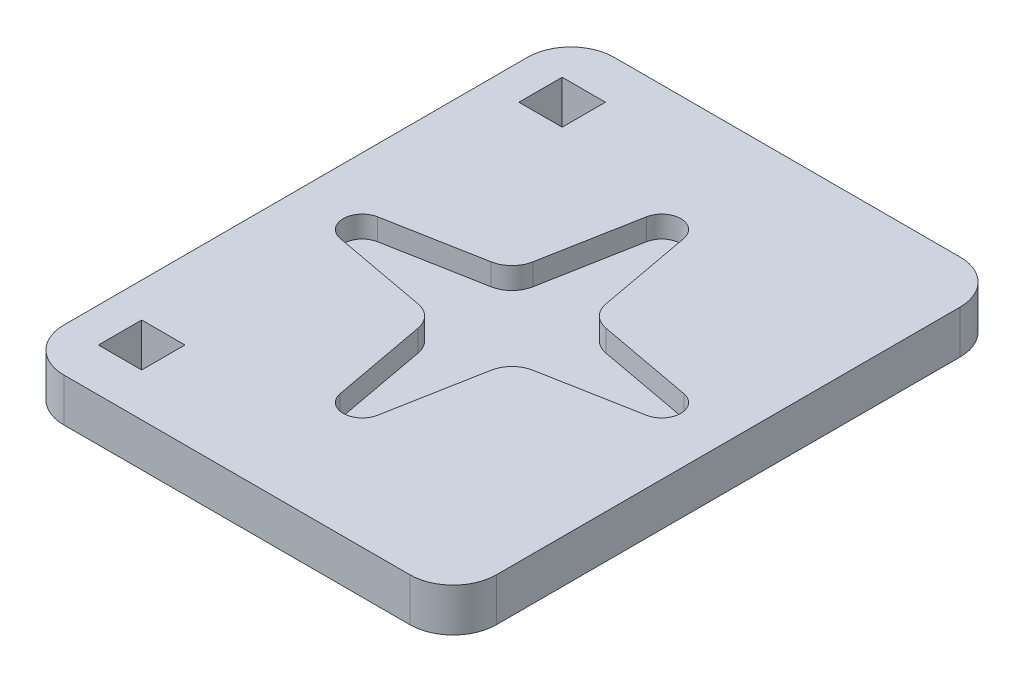
ISO-10303-21;
HEADER;
FILE_DESCRIPTION(('STEP AP214'),'2;1');
FILE_NAME('part.step','',(''),(''),'','','');
FILE_SCHEMA(('AUTOMOTIVE_DESIGN { 1 0 10303 214 1 1 1 1 }'));
ENDSEC;
DATA;
#1=APPLICATION_CONTEXT('core data for automotive mechanical design processes');
#2=APPLICATION_PROTOCOL_DEFINITION('international standard','automotive_design',2000,#1);
#3=PRODUCT_CONTEXT('',#1,'mechanical');
#4=PRODUCT('Part','Part','',(#3));
#5=PRODUCT_RELATED_PRODUCT_CATEGORY('part','',(#4));
#6=PRODUCT_DEFINITION_FORMATION('','',#4);
#7=PRODUCT_DEFINITION_CONTEXT('part definition',#1,'design');
#8=PRODUCT_DEFINITION('design','',#6,#7);
#9=PRODUCT_DEFINITION_SHAPE('','',#8);
#10=(LENGTH_UNIT() NAMED_UNIT(*) SI_UNIT(.MILLI.,.METRE.));
#11=(NAMED_UNIT(*) PLANE_ANGLE_UNIT() SI_UNIT($,.RADIAN.));
#12=(NAMED_UNIT(*) SI_UNIT($,.STERADIAN.) SOLID_ANGLE_UNIT());
#13=UNCERTAINTY_MEASURE_WITH_UNIT(LENGTH_MEASURE(1.E-05),#10,'distance_accuracy_value','');
#14=(GEOMETRIC_REPRESENTATION_CONTEXT(3) GLOBAL_UNCERTAINTY_ASSIGNED_CONTEXT((#13)) GLOBAL_UNIT_ASSIGNED_CONTEXT((#10,
#11,#12)) REPRESENTATION_CONTEXT('',''));
#15=CARTESIAN_POINT('',(0.,0.,0.));
#16=DIRECTION('',(0.,0.,1.));
#17=DIRECTION('',(1.,0.,0.));
#18=AXIS2_PLACEMENT_3D('',#15,#16,#17);
#19=CARTESIAN_POINT('',(5.00000000000001,5.,58.6));
#20=DIRECTION('',(0.,1.,0.));
#21=DIRECTION('',(0.,0.,1.));
#22=AXIS2_PLACEMENT_3D('',#19,#20,#21);
#23=PLANE('',#22);
#24=CARTESIAN_POINT('',(7.70003460000019,5.,31.8000000000002));
#25=DIRECTION('',(0.,1.,0.));
#26=DIRECTION('',(0.,0.,1.));
#27=AXIS2_PLACEMENT_3D('',#24,#25,#26);
#28=CIRCLE('',#27,2.1999956);
#29=CARTESIAN_POINT('',(7.29844277399619,5.,29.6369686444008));
#30=VERTEX_POINT('',#29);
#31=CARTESIAN_POINT('',(7.29844277399893,5.,33.9630313555991));
#32=VERTEX_POINT('',#31);
#33=EDGE_CURVE('E47',#30,#32,#28,.T.);
#34=ORIENTED_EDGE('',*,*,#33,.F.);
#35=DIRECTION('',(0.983198037123069,0.,-0.182542104176939));
#36=VECTOR('',#35,1.);
#37=CARTESIAN_POINT('',(5.56229202427042,5.,29.9593051412786));
#38=LINE('',#37,#36);
#39=CARTESIAN_POINT('',(18.3779641665887,5.,27.5799271614914));
#40=VERTEX_POINT('',#39);
#41=EDGE_CURVE('E261',#30,#40,#38,.T.);
#42=ORIENTED_EDGE('',*,*,#41,.T.);
#43=CARTESIAN_POINT('',(17.8303389493105,5.,24.6303389493105));
#44=DIRECTION('',(0.,1.,0.));
#45=DIRECTION('',(0.,0.,1.));
#46=AXIS2_PLACEMENT_3D('',#43,#44,#45);
#47=CIRCLE('',#46,2.999994);
#48=CARTESIAN_POINT('',(20.7799271614915,5.,25.1779641665886));
#49=VERTEX_POINT('',#48);
#50=EDGE_CURVE('E264',#40,#49,#47,.T.);
#51=ORIENTED_EDGE('',*,*,#50,.T.);
#52=DIRECTION('',(0.182542104176916,0.,-0.983198037123073));
#53=VECTOR('',#52,1.);
#54=CARTESIAN_POINT('',(24.6063224178299,5.,4.56844877696193));
#55=LINE('',#54,#53);
#56=CARTESIAN_POINT('',(22.8369686444006,5.,14.0984427739961));
#57=VERTEX_POINT('',#56);
#58=EDGE_CURVE('E332',#49,#57,#55,.T.);
#59=ORIENTED_EDGE('',*,*,#58,.T.);
#60=CARTESIAN_POINT('',(25.,5.,14.5000346));
#61=DIRECTION('',(0.,1.,0.));
#62=DIRECTION('',(0.,0.,1.));
#63=AXIS2_PLACEMENT_3D('',#60,#61,#62);
#64=CIRCLE('',#63,2.19999559999999);
#65=CARTESIAN_POINT('',(27.1630313555994,5.,14.098442773996));
#66=VERTEX_POINT('',#65);
#67=EDGE_CURVE('E329',#66,#57,#64,.T.);
#68=ORIENTED_EDGE('',*,*,#67,.F.);
#69=DIRECTION('',(0.182542104176938,0.,0.983198037123069));
#70=VECTOR('',#69,1.);
#71=CARTESIAN_POINT('',(23.7275965923028,5.,-4.40530314899147));
#72=LINE('',#71,#70);
#73=CARTESIAN_POINT('',(29.2200728385083,5.,25.1779641665858));
#74=VERTEX_POINT('',#73);
#75=EDGE_CURVE('E326',#66,#74,#72,.T.);
#76=ORIENTED_EDGE('',*,*,#75,.T.);
#77=CARTESIAN_POINT('',(32.1696610506893,5.,24.6303389493076));
#78=DIRECTION('',(0.,1.,0.));
#79=DIRECTION('',(0.,0.,1.));
#80=AXIS2_PLACEMENT_3D('',#77,#78,#79);
#81=CIRCLE('',#80,2.99999400000002);
#82=CARTESIAN_POINT('',(31.6220358334112,5.,27.5799271614886));
#83=VERTEX_POINT('',#82);
#84=EDGE_CURVE('E323',#74,#83,#81,.T.);
#85=ORIENTED_EDGE('',*,*,#84,.T.);
#86=DIRECTION('',(0.983198037123074,0.,0.182542104176913));
#87=VECTOR('',#86,1.);
#88=CARTESIAN_POINT('',(-3.89621103440232,5.,20.9855532153228));
#89=LINE('',#88,#87);
#90=CARTESIAN_POINT('',(42.7015572260037,5.,29.6369686443977));
#91=VERTEX_POINT('',#90);
#92=EDGE_CURVE('E320',#83,#91,#89,.T.);
#93=ORIENTED_EDGE('',*,*,#92,.T.);
#94=CARTESIAN_POINT('',(42.2999653999997,5.,31.7999999999971));
#95=DIRECTION('',(0.,1.,0.));
#96=DIRECTION('',(0.,0.,1.));
#97=AXIS2_PLACEMENT_3D('',#94,#95,#96);
#98=CIRCLE('',#97,2.1999956);
#99=CARTESIAN_POINT('',(42.7015572260037,5.,33.9630313555965));
#100=VERTEX_POINT('',#99);
#101=EDGE_CURVE('E317',#100,#91,#98,.T.);
#102=ORIENTED_EDGE('',*,*,#101,.F.);
#103=DIRECTION('',(-0.983198037123069,0.,0.182542104176938));
#104=VECTOR('',#103,1.);
#105=CARTESIAN_POINT('',(7.51840141540983,5.,40.4951917655618));
#106=LINE('',#105,#104);
#107=CARTESIAN_POINT('',(31.6220358334139,5.,36.0200728385054));
#108=VERTEX_POINT('',#107);
#109=EDGE_CURVE('E314',#100,#108,#106,.T.);
#110=ORIENTED_EDGE('',*,*,#109,.T.);
#111=CARTESIAN_POINT('',(32.1696610506921,5.,38.9696610506864));
#112=DIRECTION('',(0.,1.,0.));
#113=DIRECTION('',(0.,0.,1.));
#114=AXIS2_PLACEMENT_3D('',#111,#112,#113);
#115=CIRCLE('',#114,2.999994);
#116=CARTESIAN_POINT('',(29.2200728385111,5.,38.4220358334083));
#117=VERTEX_POINT('',#116);
#118=EDGE_CURVE('E311',#108,#117,#115,.T.);
#119=ORIENTED_EDGE('',*,*,#118,.T.);
#120=DIRECTION('',(-0.182542104176915,0.,0.983198037123073));
#121=VECTOR('',#120,1.);
#122=CARTESIAN_POINT('',(35.1422090421174,5.,6.5245581681019));
#123=LINE('',#122,#121);
#124=CARTESIAN_POINT('',(27.163031355602,5.,49.5015572260008));
#125=VERTEX_POINT('',#124);
#126=EDGE_CURVE('E308',#117,#125,#123,.T.);
#127=ORIENTED_EDGE('',*,*,#126,.T.);
#128=CARTESIAN_POINT('',(25.0000000000026,5.,49.0999653999968));
#129=DIRECTION('',(0.,1.,0.));
#130=DIRECTION('',(0.,0.,1.));
#131=AXIS2_PLACEMENT_3D('',#128,#129,#130);
#132=CIRCLE('',#131,2.1999956);
#133=CARTESIAN_POINT('',(22.8369686444032,5.,49.5015572260009));
#134=VERTEX_POINT('',#133);
#135=EDGE_CURVE('E305',#134,#125,#132,.T.);
#136=ORIENTED_EDGE('',*,*,#135,.F.);
#137=DIRECTION('',(-0.182542104176939,0.,-0.983198037123069));
#138=VECTOR('',#137,1.);
#139=CARTESIAN_POINT('',(13.1917099680195,5.,-2.44919375785203));
#140=LINE('',#139,#138);
#141=CARTESIAN_POINT('',(20.7799271614943,5.,38.422035833411));
#142=VERTEX_POINT('',#141);
#143=EDGE_CURVE('E302',#134,#142,#140,.T.);
#144=ORIENTED_EDGE('',*,*,#143,.T.);
#145=CARTESIAN_POINT('',(17.8303389493133,5.,38.9696610506892));
#146=DIRECTION('',(0.,1.,0.));
#147=DIRECTION('',(0.,0.,1.));
#148=AXIS2_PLACEMENT_3D('',#145,#146,#147);
#149=CIRCLE('',#148,2.99999400000001);
#150=CARTESIAN_POINT('',(18.3779641665915,5.,36.0200728385082));
#151=VERTEX_POINT('',#150);
#152=EDGE_CURVE('E299',#142,#151,#149,.T.);
#153=ORIENTED_EDGE('',*,*,#152,.T.);
#154=DIRECTION('',(-0.983198037123074,0.,-0.182542104176913));
#155=VECTOR('',#154,1.);
#156=CARTESIAN_POINT('',(-5.85232042554228,5.,31.5214398396103));
#157=LINE('',#156,#155);
#158=EDGE_CURVE('E297',#151,#32,#157,.T.);
#159=ORIENTED_EDGE('',*,*,#158,.T.);
#160=EDGE_LOOP('',(#34,#42,#51,#59,#68,#76,#85,#93,#102,#110,#119,#127,#136,#144,#153,#159));
#161=FACE_BOUND('',#160,.T.);
#162=CARTESIAN_POINT('',(5.00000000000001,5.,58.6));
#163=DIRECTION('',(0.,1.,0.));
#164=DIRECTION('',(0.,0.,1.));
#165=AXIS2_PLACEMENT_3D('',#162,#163,#164);
#166=CIRCLE('',#165,5.);
#167=CARTESIAN_POINT('',(0.,5.,58.6));
#168=VERTEX_POINT('',#167);
#169=CARTESIAN_POINT('',(5.00000000000001,5.,63.6));
#170=VERTEX_POINT('',#169);
#171=EDGE_CURVE('E427',#168,#170,#166,.T.);
#172=ORIENTED_EDGE('',*,*,#171,.T.);
#173=DIRECTION('',(1.,0.,0.));
#174=VECTOR('',#173,1.);
#175=CARTESIAN_POINT('',(5.00000000000001,5.,63.6));
#176=LINE('',#175,#174);
#177=CARTESIAN_POINT('',(45.,5.,63.6));
#178=VERTEX_POINT('',#177);
#179=EDGE_CURVE('E430',#170,#178,#176,.T.);
#180=ORIENTED_EDGE('',*,*,#179,.T.);
#181=CARTESIAN_POINT('',(45.,5.,58.6));
#182=DIRECTION('',(0.,1.,0.));
#183=DIRECTION('',(0.,0.,1.));
#184=AXIS2_PLACEMENT_3D('',#181,#182,#183);
#185=CIRCLE('',#184,5.);
#186=CARTESIAN_POINT('',(50.,5.,58.6));
#187=VERTEX_POINT('',#186);
#188=EDGE_CURVE('E433',#178,#187,#185,.T.);
#189=ORIENTED_EDGE('',*,*,#188,.T.);
#190=DIRECTION('',(0.,0.,-1.));
#191=VECTOR('',#190,1.);
#192=CARTESIAN_POINT('',(50.,5.,5.00000000000004));
#193=LINE('',#192,#191);
#194=CARTESIAN_POINT('',(50.,5.,5.00000000000004));
#195=VERTEX_POINT('',#194);
#196=EDGE_CURVE('E435',#187,#195,#193,.T.);
#197=ORIENTED_EDGE('',*,*,#196,.T.);
#198=CARTESIAN_POINT('',(45.,5.,5.));
#199=DIRECTION('',(0.,1.,0.));
#200=DIRECTION('',(0.,0.,1.));
#201=AXIS2_PLACEMENT_3D('',#198,#199,#200);
#202=CIRCLE('',#201,5.);
#203=CARTESIAN_POINT('',(45.,5.,0.));
#204=VERTEX_POINT('',#203);
#205=EDGE_CURVE('E437',#195,#204,#202,.T.);
#206=ORIENTED_EDGE('',*,*,#205,.T.);
#207=DIRECTION('',(-1.,0.,0.));
#208=VECTOR('',#207,1.);
#209=CARTESIAN_POINT('',(5.00000000000004,5.,0.));
#210=LINE('',#209,#208);
#211=CARTESIAN_POINT('',(5.,5.,0.));
#212=VERTEX_POINT('',#211);
#213=EDGE_CURVE('E439',#204,#212,#210,.T.);
#214=ORIENTED_EDGE('',*,*,#213,.T.);
#215=CARTESIAN_POINT('',(5.,5.,5.));
#216=DIRECTION('',(0.,1.,0.));
#217=DIRECTION('',(0.,0.,-1.));
#218=AXIS2_PLACEMENT_3D('',#215,#216,#217);
#219=CIRCLE('',#218,5.);
#220=CARTESIAN_POINT('',(0.,5.,5.00000000000004));
#221=VERTEX_POINT('',#220);
#222=EDGE_CURVE('E441',#212,#221,#219,.T.);
#223=ORIENTED_EDGE('',*,*,#222,.T.);
#224=DIRECTION('',(0.,0.,1.));
#225=VECTOR('',#224,1.);
#226=CARTESIAN_POINT('',(0.,5.,5.00000000000004));
#227=LINE('',#226,#225);
#228=EDGE_CURVE('E443',#221,#168,#227,.T.);
#229=ORIENTED_EDGE('',*,*,#228,.T.);
#230=EDGE_LOOP('',(#172,#180,#189,#197,#206,#214,#223,#229));
#231=FACE_BOUND('',#230,.T.);
#232=DIRECTION('',(0.,0.,1.));
#233=VECTOR('',#232,1.);
#234=CARTESIAN_POINT('',(4.00000000000001,5.,53.6));
#235=LINE('',#234,#233);
#236=CARTESIAN_POINT('',(4.00000000000001,5.,53.6));
#237=VERTEX_POINT('',#236);
#238=CARTESIAN_POINT('',(4.00000000000001,5.,58.6));
#239=VERTEX_POINT('',#238);
#240=EDGE_CURVE('E398',#237,#239,#235,.T.);
#241=ORIENTED_EDGE('',*,*,#240,.F.);
#242=DIRECTION('',(-1.,0.,0.));
#243=VECTOR('',#242,1.);
#244=CARTESIAN_POINT('',(4.00000000000001,5.,53.6));
#245=LINE('',#244,#243);
#246=CARTESIAN_POINT('',(9.00000000000001,5.,53.6));
#247=VERTEX_POINT('',#246);
#248=EDGE_CURVE('E396',#247,#237,#245,.T.);
#249=ORIENTED_EDGE('',*,*,#248,.F.);
#250=DIRECTION('',(0.,0.,-1.));
#251=VECTOR('',#250,1.);
#252=CARTESIAN_POINT('',(9.00000000000001,5.,53.6));
#253=LINE('',#252,#251);
#254=CARTESIAN_POINT('',(9.00000000000001,5.,58.6));
#255=VERTEX_POINT('',#254);
#256=EDGE_CURVE('E404',#255,#247,#253,.T.);
#257=ORIENTED_EDGE('',*,*,#256,.F.);
#258=DIRECTION('',(1.,0.,0.));
#259=VECTOR('',#258,1.);
#260=CARTESIAN_POINT('',(4.00000000000001,5.,58.6));
#261=LINE('',#260,#259);
#262=EDGE_CURVE('E401',#239,#255,#261,.T.);
#263=ORIENTED_EDGE('',*,*,#262,.F.);
#264=EDGE_LOOP('',(#241,#249,#257,#263));
#265=FACE_BOUND('',#264,.T.);
#266=DIRECTION('',(-1.,0.,0.));
#267=VECTOR('',#266,1.);
#268=CARTESIAN_POINT('',(4.00000000000001,5.,5.));
#269=LINE('',#268,#267);
#270=CARTESIAN_POINT('',(9.00000000000001,5.,5.));
#271=VERTEX_POINT('',#270);
#272=CARTESIAN_POINT('',(4.00000000000001,5.,5.));
#273=VERTEX_POINT('',#272);
#274=EDGE_CURVE('E369',#271,#273,#269,.T.);
#275=ORIENTED_EDGE('',*,*,#274,.F.);
#276=DIRECTION('',(0.,0.,-1.));
#277=VECTOR('',#276,1.);
#278=CARTESIAN_POINT('',(9.00000000000001,5.,10.));
#279=LINE('',#278,#277);
#280=CARTESIAN_POINT('',(9.00000000000001,5.,10.));
#281=VERTEX_POINT('',#280);
#282=EDGE_CURVE('E367',#281,#271,#279,.T.);
#283=ORIENTED_EDGE('',*,*,#282,.F.);
#284=DIRECTION('',(1.,0.,0.));
#285=VECTOR('',#284,1.);
#286=CARTESIAN_POINT('',(4.00000000000001,5.,10.));
#287=LINE('',#286,#285);
#288=CARTESIAN_POINT('',(4.00000000000001,5.,10.));
#289=VERTEX_POINT('',#288);
#290=EDGE_CURVE('E374',#289,#281,#287,.T.);
#291=ORIENTED_EDGE('',*,*,#290,.F.);
#292=DIRECTION('',(0.,0.,1.));
#293=VECTOR('',#292,1.);
#294=CARTESIAN_POINT('',(4.00000000000001,5.,10.));
#295=LINE('',#294,#293);
#296=EDGE_CURVE('E372',#273,#289,#295,.T.);
#297=ORIENTED_EDGE('',*,*,#296,.F.);
#298=EDGE_LOOP('',(#275,#283,#291,#297));
#299=FACE_BOUND('',#298,.T.);
#300=ADVANCED_FACE('F32',(#161,#231,#265,#299),#23,.T.);
#301=CARTESIAN_POINT('',(5.00000000000001,0.,58.6));
#302=DIRECTION('',(0.,1.,0.));
#303=DIRECTION('',(0.,0.,1.));
#304=AXIS2_PLACEMENT_3D('',#301,#302,#303);
#305=PLANE('',#304);
#306=DIRECTION('',(-1.,0.,0.));
#307=VECTOR('',#306,1.);
#308=CARTESIAN_POINT('',(4.00000000000001,0.,53.6));
#309=LINE('',#308,#307);
#310=CARTESIAN_POINT('',(9.00000000000001,0.,53.6));
#311=VERTEX_POINT('',#310);
#312=CARTESIAN_POINT('',(4.00000000000001,0.,53.6));
#313=VERTEX_POINT('',#312);
#314=EDGE_CURVE('E395',#311,#313,#309,.T.);
#315=ORIENTED_EDGE('',*,*,#314,.T.);
#316=DIRECTION('',(0.,0.,1.));
#317=VECTOR('',#316,1.);
#318=CARTESIAN_POINT('',(4.00000000000001,0.,53.6));
#319=LINE('',#318,#317);
#320=CARTESIAN_POINT('',(4.00000000000001,0.,58.6));
#321=VERTEX_POINT('',#320);
#322=EDGE_CURVE('E409',#313,#321,#319,.T.);
#323=ORIENTED_EDGE('',*,*,#322,.T.);
#324=DIRECTION('',(1.,0.,0.));
#325=VECTOR('',#324,1.);
#326=CARTESIAN_POINT('',(4.00000000000001,0.,58.6));
#327=LINE('',#326,#325);
#328=CARTESIAN_POINT('',(9.00000000000001,0.,58.6));
#329=VERTEX_POINT('',#328);
#330=EDGE_CURVE('E412',#321,#329,#327,.T.);
#331=ORIENTED_EDGE('',*,*,#330,.T.);
#332=DIRECTION('',(0.,0.,-1.));
#333=VECTOR('',#332,1.);
#334=CARTESIAN_POINT('',(9.00000000000001,0.,53.6));
#335=LINE('',#334,#333);
#336=EDGE_CURVE('E399',#329,#311,#335,.T.);
#337=ORIENTED_EDGE('',*,*,#336,.T.);
#338=EDGE_LOOP('',(#315,#323,#331,#337));
#339=FACE_BOUND('',#338,.T.);
#340=CARTESIAN_POINT('',(5.00000000000001,0.,58.6));
#341=DIRECTION('',(0.,1.,0.));
#342=DIRECTION('',(0.,0.,1.));
#343=AXIS2_PLACEMENT_3D('',#340,#341,#342);
#344=CIRCLE('',#343,5.);
#345=CARTESIAN_POINT('',(0.,0.,58.6));
#346=VERTEX_POINT('',#345);
#347=CARTESIAN_POINT('',(5.00000000000001,0.,63.6));
#348=VERTEX_POINT('',#347);
#349=EDGE_CURVE('E426',#346,#348,#344,.T.);
#350=ORIENTED_EDGE('',*,*,#349,.F.);
#351=DIRECTION('',(0.,0.,1.));
#352=VECTOR('',#351,1.);
#353=CARTESIAN_POINT('',(0.,0.,5.00000000000004));
#354=LINE('',#353,#352);
#355=CARTESIAN_POINT('',(0.,0.,5.00000000000004));
#356=VERTEX_POINT('',#355);
#357=EDGE_CURVE('E431',#356,#346,#354,.T.);
#358=ORIENTED_EDGE('',*,*,#357,.F.);
#359=CARTESIAN_POINT('',(5.,0.,5.));
#360=DIRECTION('',(0.,1.,0.));
#361=DIRECTION('',(0.,0.,-1.));
#362=AXIS2_PLACEMENT_3D('',#359,#360,#361);
#363=CIRCLE('',#362,5.);
#364=CARTESIAN_POINT('',(5.,0.,0.));
#365=VERTEX_POINT('',#364);
#366=EDGE_CURVE('E458',#365,#356,#363,.T.);
#367=ORIENTED_EDGE('',*,*,#366,.F.);
#368=DIRECTION('',(-1.,0.,0.));
#369=VECTOR('',#368,1.);
#370=CARTESIAN_POINT('',(5.00000000000004,0.,0.));
#371=LINE('',#370,#369);
#372=CARTESIAN_POINT('',(45.,0.,0.));
#373=VERTEX_POINT('',#372);
#374=EDGE_CURVE('E456',#373,#365,#371,.T.);
#375=ORIENTED_EDGE('',*,*,#374,.F.);
#376=CARTESIAN_POINT('',(45.,0.,5.));
#377=DIRECTION('',(0.,1.,0.));
#378=DIRECTION('',(0.,0.,1.));
#379=AXIS2_PLACEMENT_3D('',#376,#377,#378);
#380=CIRCLE('',#379,5.);
#381=CARTESIAN_POINT('',(50.,0.,5.00000000000004));
#382=VERTEX_POINT('',#381);
#383=EDGE_CURVE('E454',#382,#373,#380,.T.);
#384=ORIENTED_EDGE('',*,*,#383,.F.);
#385=DIRECTION('',(0.,0.,-1.));
#386=VECTOR('',#385,1.);
#387=CARTESIAN_POINT('',(50.,0.,5.00000000000004));
#388=LINE('',#387,#386);
#389=CARTESIAN_POINT('',(50.,0.,58.6));
#390=VERTEX_POINT('',#389);
#391=EDGE_CURVE('E452',#390,#382,#388,.T.);
#392=ORIENTED_EDGE('',*,*,#391,.F.);
#393=CARTESIAN_POINT('',(45.,0.,58.6));
#394=DIRECTION('',(0.,1.,0.));
#395=DIRECTION('',(0.,0.,1.));
#396=AXIS2_PLACEMENT_3D('',#393,#394,#395);
#397=CIRCLE('',#396,5.);
#398=CARTESIAN_POINT('',(45.,0.,63.6));
#399=VERTEX_POINT('',#398);
#400=EDGE_CURVE('E450',#399,#390,#397,.T.);
#401=ORIENTED_EDGE('',*,*,#400,.F.);
#402=DIRECTION('',(1.,0.,0.));
#403=VECTOR('',#402,1.);
#404=CARTESIAN_POINT('',(5.00000000000001,0.,63.6));
#405=LINE('',#404,#403);
#406=EDGE_CURVE('E448',#348,#399,#405,.T.);
#407=ORIENTED_EDGE('',*,*,#406,.F.);
#408=EDGE_LOOP('',(#350,#358,#367,#375,#384,#392,#401,#407));
#409=FACE_BOUND('',#408,.T.);
#410=DIRECTION('',(0.,0.,-1.));
#411=VECTOR('',#410,1.);
#412=CARTESIAN_POINT('',(9.00000000000001,0.,10.));
#413=LINE('',#412,#411);
#414=CARTESIAN_POINT('',(9.00000000000001,0.,10.));
#415=VERTEX_POINT('',#414);
#416=CARTESIAN_POINT('',(9.00000000000001,0.,5.));
#417=VERTEX_POINT('',#416);
#418=EDGE_CURVE('E339',#415,#417,#413,.T.);
#419=ORIENTED_EDGE('',*,*,#418,.T.);
#420=DIRECTION('',(-1.,0.,0.));
#421=VECTOR('',#420,1.);
#422=CARTESIAN_POINT('',(4.00000000000001,0.,5.));
#423=LINE('',#422,#421);
#424=CARTESIAN_POINT('',(4.00000000000001,0.,5.));
#425=VERTEX_POINT('',#424);
#426=EDGE_CURVE('E379',#417,#425,#423,.T.);
#427=ORIENTED_EDGE('',*,*,#426,.T.);
#428=DIRECTION('',(0.,0.,1.));
#429=VECTOR('',#428,1.);
#430=CARTESIAN_POINT('',(4.00000000000001,0.,10.));
#431=LINE('',#430,#429);
#432=CARTESIAN_POINT('',(4.00000000000001,0.,10.));
#433=VERTEX_POINT('',#432);
#434=EDGE_CURVE('E382',#425,#433,#431,.T.);
#435=ORIENTED_EDGE('',*,*,#434,.T.);
#436=DIRECTION('',(1.,0.,0.));
#437=VECTOR('',#436,1.);
#438=CARTESIAN_POINT('',(4.00000000000001,0.,10.));
#439=LINE('',#438,#437);
#440=EDGE_CURVE('E370',#433,#415,#439,.T.);
#441=ORIENTED_EDGE('',*,*,#440,.T.);
#442=EDGE_LOOP('',(#419,#427,#435,#441));
#443=FACE_BOUND('',#442,.T.);
#444=ADVANCED_FACE('F488',(#339,#409,#443),#305,.F.);
#445=CARTESIAN_POINT('',(5.00000000000001,5.,58.6));
#446=DIRECTION('',(0.,-1.,0.));
#447=DIRECTION('',(0.,0.,-1.));
#448=AXIS2_PLACEMENT_3D('',#445,#446,#447);
#449=CYLINDRICAL_SURFACE('',#448,5.);
#450=ORIENTED_EDGE('',*,*,#349,.T.);
#451=DIRECTION('',(0.,-1.,0.));
#452=VECTOR('',#451,1.);
#453=CARTESIAN_POINT('',(5.00000000000001,5.,63.6));
#454=LINE('',#453,#452);
#455=EDGE_CURVE('E11',#170,#348,#454,.T.);
#456=ORIENTED_EDGE('',*,*,#455,.F.);
#457=ORIENTED_EDGE('',*,*,#171,.F.);
#458=DIRECTION('',(0.,-1.,0.));
#459=VECTOR('',#458,1.);
#460=CARTESIAN_POINT('',(0.,5.,58.6));
#461=LINE('',#460,#459);
#462=EDGE_CURVE('E445',#168,#346,#461,.T.);
#463=ORIENTED_EDGE('',*,*,#462,.T.);
#464=EDGE_LOOP('',(#450,#456,#457,#463));
#465=FACE_BOUND('',#464,.T.);
#466=ADVANCED_FACE('F34',(#465),#449,.T.);
#467=CARTESIAN_POINT('',(5.00000000000001,5.,63.6));
#468=DIRECTION('',(0.,0.,-1.));
#469=DIRECTION('',(-1.,0.,0.));
#470=AXIS2_PLACEMENT_3D('',#467,#468,#469);
#471=PLANE('',#470);
#472=ORIENTED_EDGE('',*,*,#406,.T.);
#473=DIRECTION('',(0.,-1.,0.));
#474=VECTOR('',#473,1.);
#475=CARTESIAN_POINT('',(45.,5.,63.6));
#476=LINE('',#475,#474);
#477=EDGE_CURVE('E40',#178,#399,#476,.T.);
#478=ORIENTED_EDGE('',*,*,#477,.F.);
#479=ORIENTED_EDGE('',*,*,#179,.F.);
#480=ORIENTED_EDGE('',*,*,#455,.T.);
#481=EDGE_LOOP('',(#472,#478,#479,#480));
#482=FACE_BOUND('',#481,.T.);
#483=ADVANCED_FACE('F506',(#482),#471,.F.);
#484=CARTESIAN_POINT('',(45.,5.,58.6));
#485=DIRECTION('',(0.,-1.,0.));
#486=DIRECTION('',(0.,0.,-1.));
#487=AXIS2_PLACEMENT_3D('',#484,#485,#486);
#488=CYLINDRICAL_SURFACE('',#487,5.);
#489=ORIENTED_EDGE('',*,*,#400,.T.);
#490=DIRECTION('',(0.,-1.,0.));
#491=VECTOR('',#490,1.);
#492=CARTESIAN_POINT('',(50.,5.,58.6));
#493=LINE('',#492,#491);
#494=EDGE_CURVE('E475',#187,#390,#493,.T.);
#495=ORIENTED_EDGE('',*,*,#494,.F.);
#496=ORIENTED_EDGE('',*,*,#188,.F.);
#497=ORIENTED_EDGE('',*,*,#477,.T.);
#498=EDGE_LOOP('',(#489,#495,#496,#497));
#499=FACE_BOUND('',#498,.T.);
#500=ADVANCED_FACE('F482',(#499),#488,.T.);
#501=CARTESIAN_POINT('',(50.,5.,5.00000000000004));
#502=DIRECTION('',(-1.,0.,0.));
#503=DIRECTION('',(0.,0.,1.));
#504=AXIS2_PLACEMENT_3D('',#501,#502,#503);
#505=PLANE('',#504);
#506=ORIENTED_EDGE('',*,*,#391,.T.);
#507=DIRECTION('',(0.,-1.,0.));
#508=VECTOR('',#507,1.);
#509=CARTESIAN_POINT('',(50.,5.,5.00000000000004));
#510=LINE('',#509,#508);
#511=EDGE_CURVE('E472',#195,#382,#510,.T.);
#512=ORIENTED_EDGE('',*,*,#511,.F.);
#513=ORIENTED_EDGE('',*,*,#196,.F.);
#514=ORIENTED_EDGE('',*,*,#494,.T.);
#515=EDGE_LOOP('',(#506,#512,#513,#514));
#516=FACE_BOUND('',#515,.T.);
#517=ADVANCED_FACE('F494',(#516),#505,.F.);
#518=CARTESIAN_POINT('',(45.,5.,5.));
#519=DIRECTION('',(0.,-1.,0.));
#520=DIRECTION('',(0.,0.,-1.));
#521=AXIS2_PLACEMENT_3D('',#518,#519,#520);
#522=CYLINDRICAL_SURFACE('',#521,5.);
#523=ORIENTED_EDGE('',*,*,#383,.T.);
#524=DIRECTION('',(0.,-1.,0.));
#525=VECTOR('',#524,1.);
#526=CARTESIAN_POINT('',(45.,5.,0.));
#527=LINE('',#526,#525);
#528=EDGE_CURVE('E469',#204,#373,#527,.T.);
#529=ORIENTED_EDGE('',*,*,#528,.F.);
#530=ORIENTED_EDGE('',*,*,#205,.F.);
#531=ORIENTED_EDGE('',*,*,#511,.T.);
#532=EDGE_LOOP('',(#523,#529,#530,#531));
#533=FACE_BOUND('',#532,.T.);
#534=ADVANCED_FACE('F498',(#533),#522,.T.);
#535=CARTESIAN_POINT('',(5.00000000000004,5.,0.));
#536=DIRECTION('',(0.,0.,1.));
#537=DIRECTION('',(1.,0.,0.));
#538=AXIS2_PLACEMENT_3D('',#535,#536,#537);
#539=PLANE('',#538);
#540=ORIENTED_EDGE('',*,*,#374,.T.);
#541=DIRECTION('',(0.,-1.,0.));
#542=VECTOR('',#541,1.);
#543=CARTESIAN_POINT('',(5.,5.,0.));
#544=LINE('',#543,#542);
#545=EDGE_CURVE('E466',#212,#365,#544,.T.);
#546=ORIENTED_EDGE('',*,*,#545,.F.);
#547=ORIENTED_EDGE('',*,*,#213,.F.);
#548=ORIENTED_EDGE('',*,*,#528,.T.);
#549=EDGE_LOOP('',(#540,#546,#547,#548));
#550=FACE_BOUND('',#549,.T.);
#551=ADVANCED_FACE('F519',(#550),#539,.F.);
#552=CARTESIAN_POINT('',(5.,5.,5.));
#553=DIRECTION('',(0.,-1.,0.));
#554=DIRECTION('',(0.,0.,-1.));
#555=AXIS2_PLACEMENT_3D('',#552,#553,#554);
#556=CYLINDRICAL_SURFACE('',#555,5.);
#557=ORIENTED_EDGE('',*,*,#366,.T.);
#558=DIRECTION('',(0.,-1.,0.));
#559=VECTOR('',#558,1.);
#560=CARTESIAN_POINT('',(0.,5.,5.00000000000004));
#561=LINE('',#560,#559);
#562=EDGE_CURVE('E463',#221,#356,#561,.T.);
#563=ORIENTED_EDGE('',*,*,#562,.F.);
#564=ORIENTED_EDGE('',*,*,#222,.F.);
#565=ORIENTED_EDGE('',*,*,#545,.T.);
#566=EDGE_LOOP('',(#557,#563,#564,#565));
#567=FACE_BOUND('',#566,.T.);
#568=ADVANCED_FACE('F517',(#567),#556,.T.);
#569=CARTESIAN_POINT('',(0.,5.,5.00000000000004));
#570=DIRECTION('',(1.,0.,0.));
#571=DIRECTION('',(0.,0.,-1.));
#572=AXIS2_PLACEMENT_3D('',#569,#570,#571);
#573=PLANE('',#572);
#574=ORIENTED_EDGE('',*,*,#357,.T.);
#575=ORIENTED_EDGE('',*,*,#462,.F.);
#576=ORIENTED_EDGE('',*,*,#228,.F.);
#577=ORIENTED_EDGE('',*,*,#562,.T.);
#578=EDGE_LOOP('',(#574,#575,#576,#577));
#579=FACE_BOUND('',#578,.T.);
#580=ADVANCED_FACE('F512',(#579),#573,.F.);
#581=CARTESIAN_POINT('',(4.00000000000001,5.,53.6));
#582=DIRECTION('',(0.,0.,1.));
#583=DIRECTION('',(1.,0.,0.));
#584=AXIS2_PLACEMENT_3D('',#581,#582,#583);
#585=PLANE('',#584);
#586=ORIENTED_EDGE('',*,*,#314,.F.);
#587=DIRECTION('',(0.,-1.,0.));
#588=VECTOR('',#587,1.);
#589=CARTESIAN_POINT('',(9.00000000000001,5.,53.6));
#590=LINE('',#589,#588);
#591=EDGE_CURVE('E406',#247,#311,#590,.T.);
#592=ORIENTED_EDGE('',*,*,#591,.F.);
#593=ORIENTED_EDGE('',*,*,#248,.T.);
#594=DIRECTION('',(0.,-1.,0.));
#595=VECTOR('',#594,1.);
#596=CARTESIAN_POINT('',(4.00000000000001,5.,53.6));
#597=LINE('',#596,#595);
#598=EDGE_CURVE('E423',#237,#313,#597,.T.);
#599=ORIENTED_EDGE('',*,*,#598,.T.);
#600=EDGE_LOOP('',(#586,#592,#593,#599));
#601=FACE_BOUND('',#600,.T.);
#602=ADVANCED_FACE('F537',(#601),#585,.T.);
#603=CARTESIAN_POINT('',(4.00000000000001,5.,53.6));
#604=DIRECTION('',(1.,0.,0.));
#605=DIRECTION('',(0.,0.,-1.));
#606=AXIS2_PLACEMENT_3D('',#603,#604,#605);
#607=PLANE('',#606);
#608=ORIENTED_EDGE('',*,*,#322,.F.);
#609=ORIENTED_EDGE('',*,*,#598,.F.);
#610=ORIENTED_EDGE('',*,*,#240,.T.);
#611=DIRECTION('',(0.,-1.,0.));
#612=VECTOR('',#611,1.);
#613=CARTESIAN_POINT('',(4.00000000000001,5.,58.6));
#614=LINE('',#613,#612);
#615=EDGE_CURVE('E421',#239,#321,#614,.T.);
#616=ORIENTED_EDGE('',*,*,#615,.T.);
#617=EDGE_LOOP('',(#608,#609,#610,#616));
#618=FACE_BOUND('',#617,.T.);
#619=ADVANCED_FACE('F544',(#618),#607,.T.);
#620=CARTESIAN_POINT('',(4.00000000000001,5.,58.6));
#621=DIRECTION('',(0.,0.,-1.));
#622=DIRECTION('',(-1.,0.,0.));
#623=AXIS2_PLACEMENT_3D('',#620,#621,#622);
#624=PLANE('',#623);
#625=ORIENTED_EDGE('',*,*,#330,.F.);
#626=ORIENTED_EDGE('',*,*,#615,.F.);
#627=ORIENTED_EDGE('',*,*,#262,.T.);
#628=DIRECTION('',(0.,-1.,0.));
#629=VECTOR('',#628,1.);
#630=CARTESIAN_POINT('',(9.00000000000001,5.,58.6));
#631=LINE('',#630,#629);
#632=EDGE_CURVE('E419',#255,#329,#631,.T.);
#633=ORIENTED_EDGE('',*,*,#632,.T.);
#634=EDGE_LOOP('',(#625,#626,#627,#633));
#635=FACE_BOUND('',#634,.T.);
#636=ADVANCED_FACE('F549',(#635),#624,.T.);
#637=CARTESIAN_POINT('',(9.00000000000001,5.,53.6));
#638=DIRECTION('',(-1.,0.,0.));
#639=DIRECTION('',(0.,0.,1.));
#640=AXIS2_PLACEMENT_3D('',#637,#638,#639);
#641=PLANE('',#640);
#642=ORIENTED_EDGE('',*,*,#336,.F.);
#643=ORIENTED_EDGE('',*,*,#632,.F.);
#644=ORIENTED_EDGE('',*,*,#256,.T.);
#645=ORIENTED_EDGE('',*,*,#591,.T.);
#646=EDGE_LOOP('',(#642,#643,#644,#645));
#647=FACE_BOUND('',#646,.T.);
#648=ADVANCED_FACE('F556',(#647),#641,.T.);
#649=CARTESIAN_POINT('',(9.00000000000001,5.,10.));
#650=DIRECTION('',(-1.,0.,0.));
#651=DIRECTION('',(0.,0.,1.));
#652=AXIS2_PLACEMENT_3D('',#649,#650,#651);
#653=PLANE('',#652);
#654=ORIENTED_EDGE('',*,*,#418,.F.);
#655=DIRECTION('',(0.,-1.,0.));
#656=VECTOR('',#655,1.);
#657=CARTESIAN_POINT('',(9.00000000000001,5.,10.));
#658=LINE('',#657,#656);
#659=EDGE_CURVE('E376',#281,#415,#658,.T.);
#660=ORIENTED_EDGE('',*,*,#659,.F.);
#661=ORIENTED_EDGE('',*,*,#282,.T.);
#662=DIRECTION('',(0.,-1.,0.));
#663=VECTOR('',#662,1.);
#664=CARTESIAN_POINT('',(9.00000000000001,5.,5.));
#665=LINE('',#664,#663);
#666=EDGE_CURVE('E392',#271,#417,#665,.T.);
#667=ORIENTED_EDGE('',*,*,#666,.T.);
#668=EDGE_LOOP('',(#654,#660,#661,#667));
#669=FACE_BOUND('',#668,.T.);
#670=ADVANCED_FACE('F576',(#669),#653,.T.);
#671=CARTESIAN_POINT('',(4.00000000000001,5.,5.));
#672=DIRECTION('',(0.,0.,1.));
#673=DIRECTION('',(1.,0.,0.));
#674=AXIS2_PLACEMENT_3D('',#671,#672,#673);
#675=PLANE('',#674);
#676=ORIENTED_EDGE('',*,*,#426,.F.);
#677=ORIENTED_EDGE('',*,*,#666,.F.);
#678=ORIENTED_EDGE('',*,*,#274,.T.);
#679=DIRECTION('',(0.,-1.,0.));
#680=VECTOR('',#679,1.);
#681=CARTESIAN_POINT('',(4.00000000000001,5.,5.));
#682=LINE('',#681,#680);
#683=EDGE_CURVE('E390',#273,#425,#682,.T.);
#684=ORIENTED_EDGE('',*,*,#683,.T.);
#685=EDGE_LOOP('',(#676,#677,#678,#684));
#686=FACE_BOUND('',#685,.T.);
#687=ADVANCED_FACE('F571',(#686),#675,.T.);
#688=CARTESIAN_POINT('',(4.00000000000001,5.,10.));
#689=DIRECTION('',(1.,0.,0.));
#690=DIRECTION('',(0.,0.,-1.));
#691=AXIS2_PLACEMENT_3D('',#688,#689,#690);
#692=PLANE('',#691);
#693=ORIENTED_EDGE('',*,*,#434,.F.);
#694=ORIENTED_EDGE('',*,*,#683,.F.);
#695=ORIENTED_EDGE('',*,*,#296,.T.);
#696=DIRECTION('',(0.,-1.,0.));
#697=VECTOR('',#696,1.);
#698=CARTESIAN_POINT('',(4.00000000000001,5.,10.));
#699=LINE('',#698,#697);
#700=EDGE_CURVE('E55',#289,#433,#699,.T.);
#701=ORIENTED_EDGE('',*,*,#700,.T.);
#702=EDGE_LOOP('',(#693,#694,#695,#701));
#703=FACE_BOUND('',#702,.T.);
#704=ADVANCED_FACE('F574',(#703),#692,.T.);
#705=CARTESIAN_POINT('',(4.00000000000001,5.,10.));
#706=DIRECTION('',(0.,0.,-1.));
#707=DIRECTION('',(-1.,0.,0.));
#708=AXIS2_PLACEMENT_3D('',#705,#706,#707);
#709=PLANE('',#708);
#710=ORIENTED_EDGE('',*,*,#440,.F.);
#711=ORIENTED_EDGE('',*,*,#700,.F.);
#712=ORIENTED_EDGE('',*,*,#290,.T.);
#713=ORIENTED_EDGE('',*,*,#659,.T.);
#714=EDGE_LOOP('',(#710,#711,#712,#713));
#715=FACE_BOUND('',#714,.T.);
#716=ADVANCED_FACE('F578',(#715),#709,.T.);
#717=CARTESIAN_POINT('',(7.70003460000019,2.5,31.8000000000002));
#718=DIRECTION('',(0.,1.,0.));
#719=DIRECTION('',(0.,0.,1.));
#720=AXIS2_PLACEMENT_3D('',#717,#718,#719);
#721=CYLINDRICAL_SURFACE('',#720,2.1999956);
#722=ORIENTED_EDGE('',*,*,#33,.T.);
#723=DIRECTION('',(0.,1.,0.));
#724=VECTOR('',#723,1.);
#725=CARTESIAN_POINT('',(7.29844277399893,2.5,33.9630313555991));
#726=LINE('',#725,#724);
#727=CARTESIAN_POINT('',(7.29844277399893,2.5,33.9630313555991));
#728=VERTEX_POINT('',#727);
#729=EDGE_CURVE('E245',#728,#32,#726,.T.);
#730=ORIENTED_EDGE('',*,*,#729,.F.);
#731=CARTESIAN_POINT('',(7.70003460000019,2.5,31.8000000000002));
#732=DIRECTION('',(0.,1.,0.));
#733=DIRECTION('',(0.,0.,1.));
#734=AXIS2_PLACEMENT_3D('',#731,#732,#733);
#735=CIRCLE('',#734,2.1999956);
#736=CARTESIAN_POINT('',(7.29844277399619,2.5,29.6369686444008));
#737=VERTEX_POINT('',#736);
#738=EDGE_CURVE('E252',#737,#728,#735,.T.);
#739=ORIENTED_EDGE('',*,*,#738,.F.);
#740=DIRECTION('',(0.,1.,0.));
#741=VECTOR('',#740,1.);
#742=CARTESIAN_POINT('',(7.29844277399619,2.5,29.6369686444008));
#743=LINE('',#742,#741);
#744=EDGE_CURVE('E337',#737,#30,#743,.T.);
#745=ORIENTED_EDGE('',*,*,#744,.T.);
#746=EDGE_LOOP('',(#722,#730,#739,#745));
#747=FACE_BOUND('',#746,.T.);
#748=ADVANCED_FACE('F255',(#747),#721,.F.);
#749=CARTESIAN_POINT('',(5.56229202427042,2.5,29.9593051412786));
#750=DIRECTION('',(0.182542104176939,0.,0.983198037123069));
#751=DIRECTION('',(0.983198037123069,0.,-0.182542104176939));
#752=AXIS2_PLACEMENT_3D('',#749,#750,#751);
#753=PLANE('',#752);
#754=ORIENTED_EDGE('',*,*,#41,.F.);
#755=ORIENTED_EDGE('',*,*,#744,.F.);
#756=DIRECTION('',(0.983198037123069,0.,-0.182542104176939));
#757=VECTOR('',#756,1.);
#758=CARTESIAN_POINT('',(5.56229202427042,2.5,29.9593051412786));
#759=LINE('',#758,#757);
#760=CARTESIAN_POINT('',(18.3779641665887,2.5,27.5799271614914));
#761=VERTEX_POINT('',#760);
#762=EDGE_CURVE('E256',#737,#761,#759,.T.);
#763=ORIENTED_EDGE('',*,*,#762,.T.);
#764=DIRECTION('',(0.,1.,0.));
#765=VECTOR('',#764,1.);
#766=CARTESIAN_POINT('',(18.3779641665887,2.5,27.5799271614914));
#767=LINE('',#766,#765);
#768=EDGE_CURVE('E340',#761,#40,#767,.T.);
#769=ORIENTED_EDGE('',*,*,#768,.T.);
#770=EDGE_LOOP('',(#754,#755,#763,#769));
#771=FACE_BOUND('',#770,.T.);
#772=ADVANCED_FACE('F585',(#771),#753,.T.);
#773=CARTESIAN_POINT('',(17.8303389493105,2.5,24.6303389493105));
#774=DIRECTION('',(0.,1.,0.));
#775=DIRECTION('',(0.,0.,1.));
#776=AXIS2_PLACEMENT_3D('',#773,#774,#775);
#777=CYLINDRICAL_SURFACE('',#776,2.999994);
#778=ORIENTED_EDGE('',*,*,#50,.F.);
#779=ORIENTED_EDGE('',*,*,#768,.F.);
#780=CARTESIAN_POINT('',(17.8303389493105,2.5,24.6303389493105));
#781=DIRECTION('',(0.,1.,0.));
#782=DIRECTION('',(0.,0.,1.));
#783=AXIS2_PLACEMENT_3D('',#780,#781,#782);
#784=CIRCLE('',#783,2.999994);
#785=CARTESIAN_POINT('',(20.7799271614915,2.5,25.1779641665886));
#786=VERTEX_POINT('',#785);
#787=EDGE_CURVE('E293',#761,#786,#784,.T.);
#788=ORIENTED_EDGE('',*,*,#787,.T.);
#789=DIRECTION('',(0.,1.,0.));
#790=VECTOR('',#789,1.);
#791=CARTESIAN_POINT('',(20.7799271614915,2.5,25.1779641665886));
#792=LINE('',#791,#790);
#793=EDGE_CURVE('E342',#786,#49,#792,.T.);
#794=ORIENTED_EDGE('',*,*,#793,.T.);
#795=EDGE_LOOP('',(#778,#779,#788,#794));
#796=FACE_BOUND('',#795,.T.);
#797=ADVANCED_FACE('F642',(#796),#777,.T.);
#798=CARTESIAN_POINT('',(24.6063224178299,2.5,4.56844877696193));
#799=DIRECTION('',(0.983198037123073,0.,0.182542104176915));
#800=DIRECTION('',(0.182542104176915,0.,-0.983198037123073));
#801=AXIS2_PLACEMENT_3D('',#798,#799,#800);
#802=PLANE('',#801);
#803=ORIENTED_EDGE('',*,*,#58,.F.);
#804=ORIENTED_EDGE('',*,*,#793,.F.);
#805=DIRECTION('',(0.182542104176916,0.,-0.983198037123073));
#806=VECTOR('',#805,1.);
#807=CARTESIAN_POINT('',(24.6063224178299,2.5,4.56844877696193));
#808=LINE('',#807,#806);
#809=CARTESIAN_POINT('',(22.8369686444006,2.5,14.0984427739961));
#810=VERTEX_POINT('',#809);
#811=EDGE_CURVE('E291',#786,#810,#808,.T.);
#812=ORIENTED_EDGE('',*,*,#811,.T.);
#813=DIRECTION('',(0.,1.,0.));
#814=VECTOR('',#813,1.);
#815=CARTESIAN_POINT('',(22.8369686444006,2.5,14.0984427739961));
#816=LINE('',#815,#814);
#817=EDGE_CURVE('E344',#810,#57,#816,.T.);
#818=ORIENTED_EDGE('',*,*,#817,.T.);
#819=EDGE_LOOP('',(#803,#804,#812,#818));
#820=FACE_BOUND('',#819,.T.);
#821=ADVANCED_FACE('F652',(#820),#802,.T.);
#822=CARTESIAN_POINT('',(25.,2.5,14.5000346));
#823=DIRECTION('',(0.,1.,0.));
#824=DIRECTION('',(0.,0.,1.));
#825=AXIS2_PLACEMENT_3D('',#822,#823,#824);
#826=CYLINDRICAL_SURFACE('',#825,2.19999559999999);
#827=ORIENTED_EDGE('',*,*,#67,.T.);
#828=ORIENTED_EDGE('',*,*,#817,.F.);
#829=CARTESIAN_POINT('',(25.,2.5,14.5000346));
#830=DIRECTION('',(0.,1.,0.));
#831=DIRECTION('',(0.,0.,1.));
#832=AXIS2_PLACEMENT_3D('',#829,#830,#831);
#833=CIRCLE('',#832,2.19999559999999);
#834=CARTESIAN_POINT('',(27.1630313555994,2.5,14.098442773996));
#835=VERTEX_POINT('',#834);
#836=EDGE_CURVE('E288',#835,#810,#833,.T.);
#837=ORIENTED_EDGE('',*,*,#836,.F.);
#838=DIRECTION('',(0.,1.,0.));
#839=VECTOR('',#838,1.);
#840=CARTESIAN_POINT('',(27.1630313555994,2.5,14.098442773996));
#841=LINE('',#840,#839);
#842=EDGE_CURVE('E346',#835,#66,#841,.T.);
#843=ORIENTED_EDGE('',*,*,#842,.T.);
#844=EDGE_LOOP('',(#827,#828,#837,#843));
#845=FACE_BOUND('',#844,.T.);
#846=ADVANCED_FACE('F662',(#845),#826,.F.);
#847=CARTESIAN_POINT('',(23.7275965923028,2.5,-4.40530314899147));
#848=DIRECTION('',(-0.983198037123069,0.,0.182542104176938));
#849=DIRECTION('',(0.182542104176938,0.,0.983198037123069));
#850=AXIS2_PLACEMENT_3D('',#847,#848,#849);
#851=PLANE('',#850);
#852=ORIENTED_EDGE('',*,*,#75,.F.);
#853=ORIENTED_EDGE('',*,*,#842,.F.);
#854=DIRECTION('',(0.182542104176938,0.,0.983198037123069));
#855=VECTOR('',#854,1.);
#856=CARTESIAN_POINT('',(23.7275965923028,2.5,-4.40530314899147));
#857=LINE('',#856,#855);
#858=CARTESIAN_POINT('',(29.2200728385083,2.5,25.1779641665858));
#859=VERTEX_POINT('',#858);
#860=EDGE_CURVE('E286',#835,#859,#857,.T.);
#861=ORIENTED_EDGE('',*,*,#860,.T.);
#862=DIRECTION('',(0.,1.,0.));
#863=VECTOR('',#862,1.);
#864=CARTESIAN_POINT('',(29.2200728385083,2.5,25.1779641665858));
#865=LINE('',#864,#863);
#866=EDGE_CURVE('E348',#859,#74,#865,.T.);
#867=ORIENTED_EDGE('',*,*,#866,.T.);
#868=EDGE_LOOP('',(#852,#853,#861,#867));
#869=FACE_BOUND('',#868,.T.);
#870=ADVANCED_FACE('F672',(#869),#851,.T.);
#871=CARTESIAN_POINT('',(32.1696610506893,2.5,24.6303389493076));
#872=DIRECTION('',(0.,1.,0.));
#873=DIRECTION('',(0.,0.,1.));
#874=AXIS2_PLACEMENT_3D('',#871,#872,#873);
#875=CYLINDRICAL_SURFACE('',#874,2.99999400000002);
#876=ORIENTED_EDGE('',*,*,#84,.F.);
#877=ORIENTED_EDGE('',*,*,#866,.F.);
#878=CARTESIAN_POINT('',(32.1696610506893,2.5,24.6303389493076));
#879=DIRECTION('',(0.,1.,0.));
#880=DIRECTION('',(0.,0.,1.));
#881=AXIS2_PLACEMENT_3D('',#878,#879,#880);
#882=CIRCLE('',#881,2.99999400000002);
#883=CARTESIAN_POINT('',(31.6220358334112,2.5,27.5799271614886));
#884=VERTEX_POINT('',#883);
#885=EDGE_CURVE('E284',#859,#884,#882,.T.);
#886=ORIENTED_EDGE('',*,*,#885,.T.);
#887=DIRECTION('',(0.,1.,0.));
#888=VECTOR('',#887,1.);
#889=CARTESIAN_POINT('',(31.6220358334112,2.5,27.5799271614886));
#890=LINE('',#889,#888);
#891=EDGE_CURVE('E350',#884,#83,#890,.T.);
#892=ORIENTED_EDGE('',*,*,#891,.T.);
#893=EDGE_LOOP('',(#876,#877,#886,#892));
#894=FACE_BOUND('',#893,.T.);
#895=ADVANCED_FACE('F682',(#894),#875,.T.);
#896=CARTESIAN_POINT('',(-3.89621103440232,2.5,20.9855532153228));
#897=DIRECTION('',(-0.182542104176913,0.,0.983198037123074));
#898=DIRECTION('',(0.983198037123074,0.,0.182542104176913));
#899=AXIS2_PLACEMENT_3D('',#896,#897,#898);
#900=PLANE('',#899);
#901=ORIENTED_EDGE('',*,*,#92,.F.);
#902=ORIENTED_EDGE('',*,*,#891,.F.);
#903=DIRECTION('',(0.983198037123074,0.,0.182542104176913));
#904=VECTOR('',#903,1.);
#905=CARTESIAN_POINT('',(-3.89621103440232,2.5,20.9855532153228));
#906=LINE('',#905,#904);
#907=CARTESIAN_POINT('',(42.7015572260037,2.5,29.6369686443977));
#908=VERTEX_POINT('',#907);
#909=EDGE_CURVE('E282',#884,#908,#906,.T.);
#910=ORIENTED_EDGE('',*,*,#909,.T.);
#911=DIRECTION('',(0.,1.,0.));
#912=VECTOR('',#911,1.);
#913=CARTESIAN_POINT('',(42.7015572260037,2.5,29.6369686443977));
#914=LINE('',#913,#912);
#915=EDGE_CURVE('E352',#908,#91,#914,.T.);
#916=ORIENTED_EDGE('',*,*,#915,.T.);
#917=EDGE_LOOP('',(#901,#902,#910,#916));
#918=FACE_BOUND('',#917,.T.);
#919=ADVANCED_FACE('F692',(#918),#900,.T.);
#920=CARTESIAN_POINT('',(42.2999653999997,2.5,31.7999999999971));
#921=DIRECTION('',(0.,1.,0.));
#922=DIRECTION('',(0.,0.,1.));
#923=AXIS2_PLACEMENT_3D('',#920,#921,#922);
#924=CYLINDRICAL_SURFACE('',#923,2.1999956);
#925=ORIENTED_EDGE('',*,*,#101,.T.);
#926=ORIENTED_EDGE('',*,*,#915,.F.);
#927=CARTESIAN_POINT('',(42.2999653999997,2.5,31.7999999999971));
#928=DIRECTION('',(0.,1.,0.));
#929=DIRECTION('',(0.,0.,1.));
#930=AXIS2_PLACEMENT_3D('',#927,#928,#929);
#931=CIRCLE('',#930,2.1999956);
#932=CARTESIAN_POINT('',(42.7015572260037,2.5,33.9630313555965));
#933=VERTEX_POINT('',#932);
#934=EDGE_CURVE('E279',#933,#908,#931,.T.);
#935=ORIENTED_EDGE('',*,*,#934,.F.);
#936=DIRECTION('',(0.,1.,0.));
#937=VECTOR('',#936,1.);
#938=CARTESIAN_POINT('',(42.7015572260037,2.5,33.9630313555965));
#939=LINE('',#938,#937);
#940=EDGE_CURVE('E354',#933,#100,#939,.T.);
#941=ORIENTED_EDGE('',*,*,#940,.T.);
#942=EDGE_LOOP('',(#925,#926,#935,#941));
#943=FACE_BOUND('',#942,.T.);
#944=ADVANCED_FACE('F702',(#943),#924,.F.);
#945=CARTESIAN_POINT('',(7.51840141540983,2.5,40.4951917655618));
#946=DIRECTION('',(-0.182542104176938,0.,-0.983198037123069));
#947=DIRECTION('',(-0.983198037123069,0.,0.182542104176938));
#948=AXIS2_PLACEMENT_3D('',#945,#946,#947);
#949=PLANE('',#948);
#950=ORIENTED_EDGE('',*,*,#109,.F.);
#951=ORIENTED_EDGE('',*,*,#940,.F.);
#952=DIRECTION('',(-0.983198037123069,0.,0.182542104176938));
#953=VECTOR('',#952,1.);
#954=CARTESIAN_POINT('',(7.51840141540983,2.5,40.4951917655618));
#955=LINE('',#954,#953);
#956=CARTESIAN_POINT('',(31.6220358334139,2.5,36.0200728385054));
#957=VERTEX_POINT('',#956);
#958=EDGE_CURVE('E277',#933,#957,#955,.T.);
#959=ORIENTED_EDGE('',*,*,#958,.T.);
#960=DIRECTION('',(0.,1.,0.));
#961=VECTOR('',#960,1.);
#962=CARTESIAN_POINT('',(31.6220358334139,2.5,36.0200728385054));
#963=LINE('',#962,#961);
#964=EDGE_CURVE('E356',#957,#108,#963,.T.);
#965=ORIENTED_EDGE('',*,*,#964,.T.);
#966=EDGE_LOOP('',(#950,#951,#959,#965));
#967=FACE_BOUND('',#966,.T.);
#968=ADVANCED_FACE('F712',(#967),#949,.T.);
#969=CARTESIAN_POINT('',(32.1696610506921,2.5,38.9696610506864));
#970=DIRECTION('',(0.,1.,0.));
#971=DIRECTION('',(0.,0.,1.));
#972=AXIS2_PLACEMENT_3D('',#969,#970,#971);
#973=CYLINDRICAL_SURFACE('',#972,2.999994);
#974=ORIENTED_EDGE('',*,*,#118,.F.);
#975=ORIENTED_EDGE('',*,*,#964,.F.);
#976=CARTESIAN_POINT('',(32.1696610506921,2.5,38.9696610506864));
#977=DIRECTION('',(0.,1.,0.));
#978=DIRECTION('',(0.,0.,1.));
#979=AXIS2_PLACEMENT_3D('',#976,#977,#978);
#980=CIRCLE('',#979,2.999994);
#981=CARTESIAN_POINT('',(29.2200728385111,2.5,38.4220358334083));
#982=VERTEX_POINT('',#981);
#983=EDGE_CURVE('E275',#957,#982,#980,.T.);
#984=ORIENTED_EDGE('',*,*,#983,.T.);
#985=DIRECTION('',(0.,1.,0.));
#986=VECTOR('',#985,1.);
#987=CARTESIAN_POINT('',(29.2200728385111,2.5,38.4220358334083));
#988=LINE('',#987,#986);
#989=EDGE_CURVE('E358',#982,#117,#988,.T.);
#990=ORIENTED_EDGE('',*,*,#989,.T.);
#991=EDGE_LOOP('',(#974,#975,#984,#990));
#992=FACE_BOUND('',#991,.T.);
#993=ADVANCED_FACE('F722',(#992),#973,.T.);
#994=CARTESIAN_POINT('',(35.1422090421174,2.5,6.5245581681019));
#995=DIRECTION('',(-0.983198037123073,0.,-0.182542104176915));
#996=DIRECTION('',(-0.182542104176915,0.,0.983198037123073));
#997=AXIS2_PLACEMENT_3D('',#994,#995,#996);
#998=PLANE('',#997);
#999=ORIENTED_EDGE('',*,*,#126,.F.);
#1000=ORIENTED_EDGE('',*,*,#989,.F.);
#1001=DIRECTION('',(-0.182542104176915,0.,0.983198037123073));
#1002=VECTOR('',#1001,1.);
#1003=CARTESIAN_POINT('',(35.1422090421174,2.5,6.5245581681019));
#1004=LINE('',#1003,#1002);
#1005=CARTESIAN_POINT('',(27.163031355602,2.5,49.5015572260008));
#1006=VERTEX_POINT('',#1005);
#1007=EDGE_CURVE('E273',#982,#1006,#1004,.T.);
#1008=ORIENTED_EDGE('',*,*,#1007,.T.);
#1009=DIRECTION('',(0.,1.,0.));
#1010=VECTOR('',#1009,1.);
#1011=CARTESIAN_POINT('',(27.163031355602,2.5,49.5015572260008));
#1012=LINE('',#1011,#1010);
#1013=EDGE_CURVE('E360',#1006,#125,#1012,.T.);
#1014=ORIENTED_EDGE('',*,*,#1013,.T.);
#1015=EDGE_LOOP('',(#999,#1000,#1008,#1014));
#1016=FACE_BOUND('',#1015,.T.);
#1017=ADVANCED_FACE('F732',(#1016),#998,.T.);
#1018=CARTESIAN_POINT('',(25.0000000000026,2.5,49.0999653999968));
#1019=DIRECTION('',(0.,1.,0.));
#1020=DIRECTION('',(0.,0.,1.));
#1021=AXIS2_PLACEMENT_3D('',#1018,#1019,#1020);
#1022=CYLINDRICAL_SURFACE('',#1021,2.1999956);
#1023=ORIENTED_EDGE('',*,*,#135,.T.);
#1024=ORIENTED_EDGE('',*,*,#1013,.F.);
#1025=CARTESIAN_POINT('',(25.0000000000026,2.5,49.0999653999968));
#1026=DIRECTION('',(0.,1.,0.));
#1027=DIRECTION('',(0.,0.,1.));
#1028=AXIS2_PLACEMENT_3D('',#1025,#1026,#1027);
#1029=CIRCLE('',#1028,2.1999956);
#1030=CARTESIAN_POINT('',(22.8369686444032,2.5,49.5015572260009));
#1031=VERTEX_POINT('',#1030);
#1032=EDGE_CURVE('E270',#1031,#1006,#1029,.T.);
#1033=ORIENTED_EDGE('',*,*,#1032,.F.);
#1034=DIRECTION('',(0.,1.,0.));
#1035=VECTOR('',#1034,1.);
#1036=CARTESIAN_POINT('',(22.8369686444032,2.5,49.5015572260009));
#1037=LINE('',#1036,#1035);
#1038=EDGE_CURVE('E362',#1031,#134,#1037,.T.);
#1039=ORIENTED_EDGE('',*,*,#1038,.T.);
#1040=EDGE_LOOP('',(#1023,#1024,#1033,#1039));
#1041=FACE_BOUND('',#1040,.T.);
#1042=ADVANCED_FACE('F742',(#1041),#1022,.F.);
#1043=CARTESIAN_POINT('',(13.1917099680195,2.5,-2.44919375785203));
#1044=DIRECTION('',(0.983198037123069,0.,-0.182542104176939));
#1045=DIRECTION('',(-0.182542104176939,0.,-0.983198037123069));
#1046=AXIS2_PLACEMENT_3D('',#1043,#1044,#1045);
#1047=PLANE('',#1046);
#1048=ORIENTED_EDGE('',*,*,#143,.F.);
#1049=ORIENTED_EDGE('',*,*,#1038,.F.);
#1050=DIRECTION('',(-0.182542104176939,0.,-0.983198037123069));
#1051=VECTOR('',#1050,1.);
#1052=CARTESIAN_POINT('',(13.1917099680195,2.5,-2.44919375785203));
#1053=LINE('',#1052,#1051);
#1054=CARTESIAN_POINT('',(20.7799271614943,2.5,38.422035833411));
#1055=VERTEX_POINT('',#1054);
#1056=EDGE_CURVE('E268',#1031,#1055,#1053,.T.);
#1057=ORIENTED_EDGE('',*,*,#1056,.T.);
#1058=DIRECTION('',(0.,1.,0.));
#1059=VECTOR('',#1058,1.);
#1060=CARTESIAN_POINT('',(20.7799271614943,2.5,38.422035833411));
#1061=LINE('',#1060,#1059);
#1062=EDGE_CURVE('E364',#1055,#142,#1061,.T.);
#1063=ORIENTED_EDGE('',*,*,#1062,.T.);
#1064=EDGE_LOOP('',(#1048,#1049,#1057,#1063));
#1065=FACE_BOUND('',#1064,.T.);
#1066=ADVANCED_FACE('F752',(#1065),#1047,.T.);
#1067=CARTESIAN_POINT('',(17.8303389493133,2.5,38.9696610506892));
#1068=DIRECTION('',(0.,1.,0.));
#1069=DIRECTION('',(0.,0.,1.));
#1070=AXIS2_PLACEMENT_3D('',#1067,#1068,#1069);
#1071=CYLINDRICAL_SURFACE('',#1070,2.99999400000001);
#1072=ORIENTED_EDGE('',*,*,#152,.F.);
#1073=ORIENTED_EDGE('',*,*,#1062,.F.);
#1074=CARTESIAN_POINT('',(17.8303389493133,2.5,38.9696610506892));
#1075=DIRECTION('',(0.,1.,0.));
#1076=DIRECTION('',(0.,0.,1.));
#1077=AXIS2_PLACEMENT_3D('',#1074,#1075,#1076);
#1078=CIRCLE('',#1077,2.99999400000001);
#1079=CARTESIAN_POINT('',(18.3779641665915,2.5,36.0200728385082));
#1080=VERTEX_POINT('',#1079);
#1081=EDGE_CURVE('E251',#1055,#1080,#1078,.T.);
#1082=ORIENTED_EDGE('',*,*,#1081,.T.);
#1083=DIRECTION('',(0.,1.,0.));
#1084=VECTOR('',#1083,1.);
#1085=CARTESIAN_POINT('',(18.3779641665915,2.5,36.0200728385082));
#1086=LINE('',#1085,#1084);
#1087=EDGE_CURVE('E247',#1080,#151,#1086,.T.);
#1088=ORIENTED_EDGE('',*,*,#1087,.T.);
#1089=EDGE_LOOP('',(#1072,#1073,#1082,#1088));
#1090=FACE_BOUND('',#1089,.T.);
#1091=ADVANCED_FACE('F762',(#1090),#1071,.T.);
#1092=CARTESIAN_POINT('',(-5.85232042554228,2.5,31.5214398396103));
#1093=DIRECTION('',(0.182542104176913,0.,-0.983198037123074));
#1094=DIRECTION('',(-0.983198037123074,0.,-0.182542104176913));
#1095=AXIS2_PLACEMENT_3D('',#1092,#1093,#1094);
#1096=PLANE('',#1095);
#1097=ORIENTED_EDGE('',*,*,#158,.F.);
#1098=ORIENTED_EDGE('',*,*,#1087,.F.);
#1099=DIRECTION('',(-0.983198037123074,0.,-0.182542104176913));
#1100=VECTOR('',#1099,1.);
#1101=CARTESIAN_POINT('',(-5.85232042554228,2.5,31.5214398396103));
#1102=LINE('',#1101,#1100);
#1103=EDGE_CURVE('E242',#1080,#728,#1102,.T.);
#1104=ORIENTED_EDGE('',*,*,#1103,.T.);
#1105=ORIENTED_EDGE('',*,*,#729,.T.);
#1106=EDGE_LOOP('',(#1097,#1098,#1104,#1105));
#1107=FACE_BOUND('',#1106,.T.);
#1108=ADVANCED_FACE('F244',(#1107),#1096,.T.);
#1109=CARTESIAN_POINT('',(0.,2.5,0.));
#1110=DIRECTION('',(0.,1.,0.));
#1111=DIRECTION('',(0.,0.,1.));
#1112=AXIS2_PLACEMENT_3D('',#1109,#1110,#1111);
#1113=PLANE('',#1112);
#1114=ORIENTED_EDGE('',*,*,#738,.T.);
#1115=ORIENTED_EDGE('',*,*,#1103,.F.);
#1116=ORIENTED_EDGE('',*,*,#1081,.F.);
#1117=ORIENTED_EDGE('',*,*,#1056,.F.);
#1118=ORIENTED_EDGE('',*,*,#1032,.T.);
#1119=ORIENTED_EDGE('',*,*,#1007,.F.);
#1120=ORIENTED_EDGE('',*,*,#983,.F.);
#1121=ORIENTED_EDGE('',*,*,#958,.F.);
#1122=ORIENTED_EDGE('',*,*,#934,.T.);
#1123=ORIENTED_EDGE('',*,*,#909,.F.);
#1124=ORIENTED_EDGE('',*,*,#885,.F.);
#1125=ORIENTED_EDGE('',*,*,#860,.F.);
#1126=ORIENTED_EDGE('',*,*,#836,.T.);
#1127=ORIENTED_EDGE('',*,*,#811,.F.);
#1128=ORIENTED_EDGE('',*,*,#787,.F.);
#1129=ORIENTED_EDGE('',*,*,#762,.F.);
#1130=EDGE_LOOP('',(#1114,#1115,#1116,#1117,#1118,#1119,#1120,#1121,#1122,#1123,#1124,#1125,
#1126,#1127,#1128,#1129));
#1131=FACE_BOUND('',#1130,.T.);
#1132=ADVANCED_FACE('F259',(#1131),#1113,.T.);
#1133=CLOSED_SHELL('',(#300,#444,#466,#483,#500,#517,#534,#551,#568,#580,#602,#619,#636,#648,
#670,#687,#704,#716,#748,#772,#797,#821,#846,#870,#895,#919,#944,#968,#993,#1017,#1042,#1066,
#1091,#1108,#1132));
#1134=MANIFOLD_SOLID_BREP('B2',#1133);
#1135=ADVANCED_BREP_SHAPE_REPRESENTATION('',(#18,#1134),#14);
#1136=SHAPE_DEFINITION_REPRESENTATION(#9,#1135);
ENDSEC;
END-ISO-10303-21;
